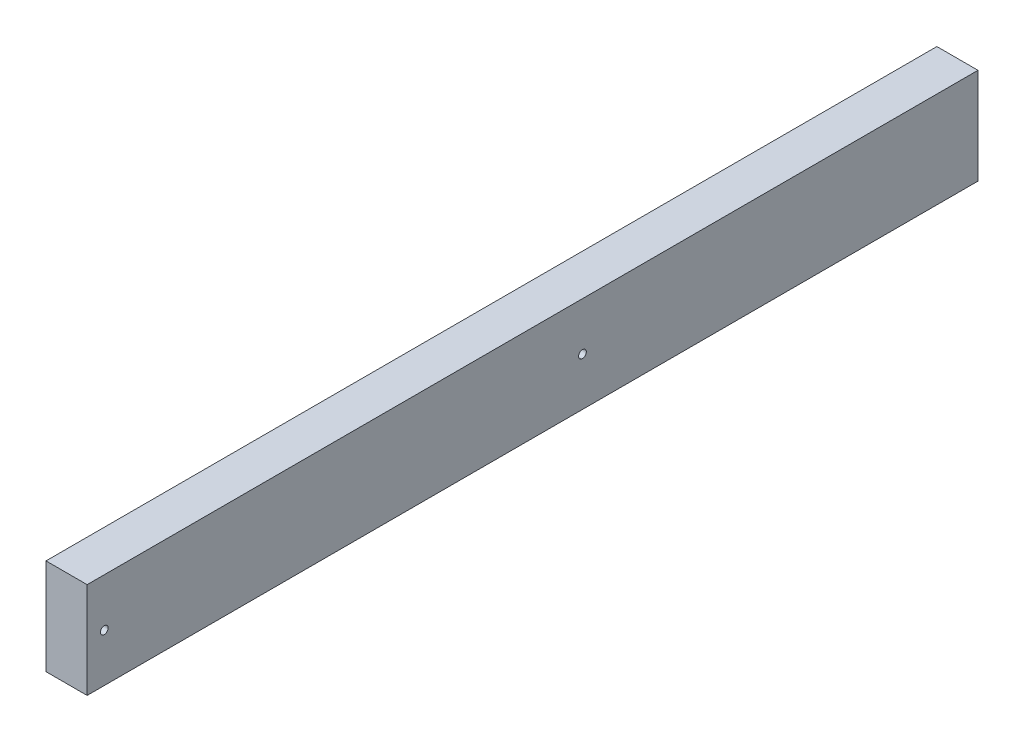
ISO-10303-21;
HEADER;
FILE_DESCRIPTION(('STEP AP214'),'2;1');
FILE_NAME('part.step','',(''),(''),'','','');
FILE_SCHEMA(('AUTOMOTIVE_DESIGN { 1 0 10303 214 1 1 1 1 }'));
ENDSEC;
DATA;
#1=APPLICATION_CONTEXT('core data for automotive mechanical design processes');
#2=APPLICATION_PROTOCOL_DEFINITION('international standard','automotive_design',2000,#1);
#3=PRODUCT_CONTEXT('',#1,'mechanical');
#4=PRODUCT('Part','Part','',(#3));
#5=PRODUCT_RELATED_PRODUCT_CATEGORY('part','',(#4));
#6=PRODUCT_DEFINITION_FORMATION('','',#4);
#7=PRODUCT_DEFINITION_CONTEXT('part definition',#1,'design');
#8=PRODUCT_DEFINITION('design','',#6,#7);
#9=PRODUCT_DEFINITION_SHAPE('','',#8);
#10=(LENGTH_UNIT() NAMED_UNIT(*) SI_UNIT(.MILLI.,.METRE.));
#11=(NAMED_UNIT(*) PLANE_ANGLE_UNIT() SI_UNIT($,.RADIAN.));
#12=(NAMED_UNIT(*) SI_UNIT($,.STERADIAN.) SOLID_ANGLE_UNIT());
#13=UNCERTAINTY_MEASURE_WITH_UNIT(LENGTH_MEASURE(1.E-05),#10,'distance_accuracy_value','');
#14=(GEOMETRIC_REPRESENTATION_CONTEXT(3) GLOBAL_UNCERTAINTY_ASSIGNED_CONTEXT((#13)) GLOBAL_UNIT_ASSIGNED_CONTEXT((#10,
#11,#12)) REPRESENTATION_CONTEXT('',''));
#15=CARTESIAN_POINT('',(0.,0.,0.));
#16=DIRECTION('',(0.,0.,1.));
#17=DIRECTION('',(1.,0.,0.));
#18=AXIS2_PLACEMENT_3D('',#15,#16,#17);
#19=CARTESIAN_POINT('',(38.1,88.8999999999993,3.43054021156412E-13));
#20=DIRECTION('',(0.,0.,-1.));
#21=DIRECTION('',(0.,1.,0.));
#22=AXIS2_PLACEMENT_3D('',#19,#20,#21);
#23=PLANE('',#22);
#24=DIRECTION('',(0.,-1.,0.));
#25=VECTOR('',#24,1.);
#26=CARTESIAN_POINT('',(0.,88.8999999999993,3.43054021156412E-13));
#27=LINE('',#26,#25);
#28=CARTESIAN_POINT('',(0.,88.8999999999993,3.43054021156412E-13));
#29=VERTEX_POINT('',#28);
#30=CARTESIAN_POINT('',(0.,0.,0.));
#31=VERTEX_POINT('',#30);
#32=EDGE_CURVE('E96',#29,#31,#27,.T.);
#33=ORIENTED_EDGE('',*,*,#32,.T.);
#34=DIRECTION('',(-1.,0.,0.));
#35=VECTOR('',#34,1.);
#36=CARTESIAN_POINT('',(38.1,0.,0.));
#37=LINE('',#36,#35);
#38=CARTESIAN_POINT('',(38.1,0.,0.));
#39=VERTEX_POINT('',#38);
#40=EDGE_CURVE('E11',#39,#31,#37,.T.);
#41=ORIENTED_EDGE('',*,*,#40,.F.);
#42=DIRECTION('',(0.,-1.,0.));
#43=VECTOR('',#42,1.);
#44=CARTESIAN_POINT('',(38.1,88.8999999999993,3.43054021156412E-13));
#45=LINE('',#44,#43);
#46=CARTESIAN_POINT('',(38.1,88.8999999999993,3.43054021156412E-13));
#47=VERTEX_POINT('',#46);
#48=EDGE_CURVE('E84',#47,#39,#45,.T.);
#49=ORIENTED_EDGE('',*,*,#48,.F.);
#50=DIRECTION('',(-1.,0.,0.));
#51=VECTOR('',#50,1.);
#52=CARTESIAN_POINT('',(38.1,88.8999999999993,3.43054021156412E-13));
#53=LINE('',#52,#51);
#54=EDGE_CURVE('E92',#47,#29,#53,.T.);
#55=ORIENTED_EDGE('',*,*,#54,.T.);
#56=EDGE_LOOP('',(#33,#41,#49,#55));
#57=FACE_BOUND('',#56,.T.);
#58=ADVANCED_FACE('F33',(#57),#23,.F.);
#59=CARTESIAN_POINT('',(38.1,0.,-825.177208973359));
#60=DIRECTION('',(0.,1.,0.));
#61=DIRECTION('',(0.,0.,1.));
#62=AXIS2_PLACEMENT_3D('',#59,#60,#61);
#63=PLANE('',#62);
#64=DIRECTION('',(0.,0.,-1.));
#65=VECTOR('',#64,1.);
#66=CARTESIAN_POINT('',(0.,0.,-825.177208973359));
#67=LINE('',#66,#65);
#68=CARTESIAN_POINT('',(0.,0.,-825.177208973359));
#69=VERTEX_POINT('',#68);
#70=EDGE_CURVE('E88',#31,#69,#67,.T.);
#71=ORIENTED_EDGE('',*,*,#70,.T.);
#72=DIRECTION('',(-1.,0.,0.));
#73=VECTOR('',#72,1.);
#74=CARTESIAN_POINT('',(38.1,0.,-825.177208973359));
#75=LINE('',#74,#73);
#76=CARTESIAN_POINT('',(38.1,0.,-825.177208973359));
#77=VERTEX_POINT('',#76);
#78=EDGE_CURVE('E41',#77,#69,#75,.T.);
#79=ORIENTED_EDGE('',*,*,#78,.F.);
#80=DIRECTION('',(0.,0.,-1.));
#81=VECTOR('',#80,1.);
#82=CARTESIAN_POINT('',(38.1,0.,-825.177208973359));
#83=LINE('',#82,#81);
#84=EDGE_CURVE('E79',#39,#77,#83,.T.);
#85=ORIENTED_EDGE('',*,*,#84,.F.);
#86=ORIENTED_EDGE('',*,*,#40,.T.);
#87=EDGE_LOOP('',(#71,#79,#85,#86));
#88=FACE_BOUND('',#87,.T.);
#89=ADVANCED_FACE('F87',(#88),#63,.F.);
#90=CARTESIAN_POINT('',(38.1,88.9000000000055,-825.177208973358));
#91=DIRECTION('',(0.,0.,1.));
#92=DIRECTION('',(0.,-1.,0.));
#93=AXIS2_PLACEMENT_3D('',#90,#91,#92);
#94=PLANE('',#93);
#95=DIRECTION('',(0.,1.,0.));
#96=VECTOR('',#95,1.);
#97=CARTESIAN_POINT('',(0.,88.9000000000055,-825.177208973358));
#98=LINE('',#97,#96);
#99=CARTESIAN_POINT('',(0.,88.9000000000055,-825.177208973358));
#100=VERTEX_POINT('',#99);
#101=EDGE_CURVE('E66',#69,#100,#98,.T.);
#102=ORIENTED_EDGE('',*,*,#101,.T.);
#103=DIRECTION('',(-1.,0.,0.));
#104=VECTOR('',#103,1.);
#105=CARTESIAN_POINT('',(38.1,88.9000000000055,-825.177208973358));
#106=LINE('',#105,#104);
#107=CARTESIAN_POINT('',(38.1,88.9000000000055,-825.177208973358));
#108=VERTEX_POINT('',#107);
#109=EDGE_CURVE('E89',#108,#100,#106,.T.);
#110=ORIENTED_EDGE('',*,*,#109,.F.);
#111=DIRECTION('',(0.,1.,0.));
#112=VECTOR('',#111,1.);
#113=CARTESIAN_POINT('',(38.1,88.9000000000055,-825.177208973358));
#114=LINE('',#113,#112);
#115=EDGE_CURVE('E82',#77,#108,#114,.T.);
#116=ORIENTED_EDGE('',*,*,#115,.F.);
#117=ORIENTED_EDGE('',*,*,#78,.T.);
#118=EDGE_LOOP('',(#102,#110,#116,#117));
#119=FACE_BOUND('',#118,.T.);
#120=ADVANCED_FACE('F90',(#119),#94,.F.);
#121=CARTESIAN_POINT('',(38.1,88.8999999999993,3.43054021156412E-13));
#122=DIRECTION('',(0.,-1.,0.));
#123=DIRECTION('',(0.,0.,-1.));
#124=AXIS2_PLACEMENT_3D('',#121,#122,#123);
#125=PLANE('',#124);
#126=DIRECTION('',(0.,0.,1.));
#127=VECTOR('',#126,1.);
#128=CARTESIAN_POINT('',(0.,88.8999999999993,3.43054021156412E-13));
#129=LINE('',#128,#127);
#130=EDGE_CURVE('E72',#100,#29,#129,.T.);
#131=ORIENTED_EDGE('',*,*,#130,.T.);
#132=ORIENTED_EDGE('',*,*,#54,.F.);
#133=DIRECTION('',(0.,0.,1.));
#134=VECTOR('',#133,1.);
#135=CARTESIAN_POINT('',(38.1,88.8999999999993,3.43054021156412E-13));
#136=LINE('',#135,#134);
#137=EDGE_CURVE('E49',#108,#47,#136,.T.);
#138=ORIENTED_EDGE('',*,*,#137,.F.);
#139=ORIENTED_EDGE('',*,*,#109,.T.);
#140=EDGE_LOOP('',(#131,#132,#138,#139));
#141=FACE_BOUND('',#140,.T.);
#142=ADVANCED_FACE('F104',(#141),#125,.F.);
#143=CARTESIAN_POINT('',(38.1,0.,0.));
#144=DIRECTION('',(-1.,0.,0.));
#145=DIRECTION('',(0.,0.,1.));
#146=AXIS2_PLACEMENT_3D('',#143,#144,#145);
#147=PLANE('',#146);
#148=CARTESIAN_POINT('',(38.1,44.45,-15.8749999999997));
#149=DIRECTION('',(1.,0.,0.));
#150=DIRECTION('',(0.,0.,-1.));
#151=AXIS2_PLACEMENT_3D('',#148,#149,#150);
#152=CIRCLE('',#151,3.571875);
#153=CARTESIAN_POINT('',(38.1,44.45,-19.4468749999997));
#154=VERTEX_POINT('',#153);
#155=EDGE_CURVE('E116',#154,#154,#152,.T.);
#156=ORIENTED_EDGE('',*,*,#155,.F.);
#157=EDGE_LOOP('',(#156));
#158=FACE_BOUND('',#157,.T.);
#159=CARTESIAN_POINT('',(38.1,44.45,-458.7875));
#160=DIRECTION('',(1.,0.,0.));
#161=DIRECTION('',(0.,0.,-1.));
#162=AXIS2_PLACEMENT_3D('',#159,#160,#161);
#163=CIRCLE('',#162,3.57187499999998);
#164=CARTESIAN_POINT('',(38.1,44.45,-462.359375));
#165=VERTEX_POINT('',#164);
#166=EDGE_CURVE('E110',#165,#165,#163,.T.);
#167=ORIENTED_EDGE('',*,*,#166,.F.);
#168=EDGE_LOOP('',(#167));
#169=FACE_BOUND('',#168,.T.);
#170=ORIENTED_EDGE('',*,*,#48,.T.);
#171=ORIENTED_EDGE('',*,*,#84,.T.);
#172=ORIENTED_EDGE('',*,*,#115,.T.);
#173=ORIENTED_EDGE('',*,*,#137,.T.);
#174=EDGE_LOOP('',(#170,#171,#172,#173));
#175=FACE_BOUND('',#174,.T.);
#176=ADVANCED_FACE('F80',(#158,#169,#175),#147,.F.);
#177=CARTESIAN_POINT('',(0.,0.,0.));
#178=DIRECTION('',(-1.,0.,0.));
#179=DIRECTION('',(0.,0.,1.));
#180=AXIS2_PLACEMENT_3D('',#177,#178,#179);
#181=PLANE('',#180);
#182=CARTESIAN_POINT('',(0.,44.45,-15.8749999999997));
#183=DIRECTION('',(1.,0.,0.));
#184=DIRECTION('',(0.,0.,-1.));
#185=AXIS2_PLACEMENT_3D('',#182,#183,#184);
#186=CIRCLE('',#185,3.571875);
#187=CARTESIAN_POINT('',(0.,44.45,-19.4468749999997));
#188=VERTEX_POINT('',#187);
#189=EDGE_CURVE('E99',#188,#188,#186,.T.);
#190=ORIENTED_EDGE('',*,*,#189,.T.);
#191=EDGE_LOOP('',(#190));
#192=FACE_BOUND('',#191,.T.);
#193=CARTESIAN_POINT('',(0.,44.45,-458.7875));
#194=DIRECTION('',(1.,0.,0.));
#195=DIRECTION('',(0.,0.,-1.));
#196=AXIS2_PLACEMENT_3D('',#193,#194,#195);
#197=CIRCLE('',#196,3.57187499999998);
#198=CARTESIAN_POINT('',(0.,44.45,-462.359375));
#199=VERTEX_POINT('',#198);
#200=EDGE_CURVE('E113',#199,#199,#197,.T.);
#201=ORIENTED_EDGE('',*,*,#200,.T.);
#202=EDGE_LOOP('',(#201));
#203=FACE_BOUND('',#202,.T.);
#204=ORIENTED_EDGE('',*,*,#32,.F.);
#205=ORIENTED_EDGE('',*,*,#130,.F.);
#206=ORIENTED_EDGE('',*,*,#101,.F.);
#207=ORIENTED_EDGE('',*,*,#70,.F.);
#208=EDGE_LOOP('',(#204,#205,#206,#207));
#209=FACE_BOUND('',#208,.T.);
#210=ADVANCED_FACE('F107',(#192,#203,#209),#181,.T.);
#211=CARTESIAN_POINT('',(0.,44.45,-458.7875));
#212=DIRECTION('',(1.,0.,0.));
#213=DIRECTION('',(0.,0.,-1.));
#214=AXIS2_PLACEMENT_3D('',#211,#212,#213);
#215=CYLINDRICAL_SURFACE('',#214,3.57187499999998);
#216=CARTESIAN_POINT('',(0.,44.45,-462.359375));
#217=CARTESIAN_POINT('',(0.396875,44.45,-462.359375));
#218=CARTESIAN_POINT('',(0.79375,44.45,-462.359375));
#219=CARTESIAN_POINT('',(1.5875,44.45,-462.359375));
#220=CARTESIAN_POINT('',(1.984375,44.45,-462.359375));
#221=CARTESIAN_POINT('',(2.778125,44.45,-462.359375));
#222=CARTESIAN_POINT('',(3.175,44.45,-462.359375));
#223=CARTESIAN_POINT('',(3.96875,44.45,-462.359375));
#224=CARTESIAN_POINT('',(4.365625,44.45,-462.359375));
#225=CARTESIAN_POINT('',(5.159375,44.45,-462.359375));
#226=CARTESIAN_POINT('',(5.55625,44.45,-462.359375));
#227=CARTESIAN_POINT('',(6.35,44.45,-462.359375));
#228=CARTESIAN_POINT('',(6.746875,44.45,-462.359375));
#229=CARTESIAN_POINT('',(7.540625,44.45,-462.359375));
#230=CARTESIAN_POINT('',(7.9375,44.45,-462.359375));
#231=CARTESIAN_POINT('',(8.73125,44.45,-462.359375));
#232=CARTESIAN_POINT('',(9.128125,44.45,-462.359375));
#233=CARTESIAN_POINT('',(9.921875,44.45,-462.359375));
#234=CARTESIAN_POINT('',(10.31875,44.45,-462.359375));
#235=CARTESIAN_POINT('',(11.1125,44.45,-462.359375));
#236=CARTESIAN_POINT('',(11.509375,44.45,-462.359375));
#237=CARTESIAN_POINT('',(12.303125,44.45,-462.359375));
#238=CARTESIAN_POINT('',(12.7,44.45,-462.359375));
#239=CARTESIAN_POINT('',(13.49375,44.45,-462.359375));
#240=CARTESIAN_POINT('',(13.890625,44.45,-462.359375));
#241=CARTESIAN_POINT('',(14.684375,44.45,-462.359375));
#242=CARTESIAN_POINT('',(15.08125,44.45,-462.359375));
#243=CARTESIAN_POINT('',(15.875,44.45,-462.359375));
#244=CARTESIAN_POINT('',(16.271875,44.45,-462.359375));
#245=CARTESIAN_POINT('',(17.065625,44.45,-462.359375));
#246=CARTESIAN_POINT('',(17.4625,44.45,-462.359375));
#247=CARTESIAN_POINT('',(18.25625,44.45,-462.359375));
#248=CARTESIAN_POINT('',(18.653125,44.45,-462.359375));
#249=CARTESIAN_POINT('',(19.446875,44.45,-462.359375));
#250=CARTESIAN_POINT('',(19.84375,44.45,-462.359375));
#251=CARTESIAN_POINT('',(20.6375,44.45,-462.359375));
#252=CARTESIAN_POINT('',(21.034375,44.45,-462.359375));
#253=CARTESIAN_POINT('',(21.828125,44.45,-462.359375));
#254=CARTESIAN_POINT('',(22.225,44.45,-462.359375));
#255=CARTESIAN_POINT('',(23.01875,44.45,-462.359375));
#256=CARTESIAN_POINT('',(23.415625,44.45,-462.359375));
#257=CARTESIAN_POINT('',(24.209375,44.45,-462.359375));
#258=CARTESIAN_POINT('',(24.60625,44.45,-462.359375));
#259=CARTESIAN_POINT('',(25.4,44.45,-462.359375));
#260=CARTESIAN_POINT('',(25.796875,44.45,-462.359375));
#261=CARTESIAN_POINT('',(26.590625,44.45,-462.359375));
#262=CARTESIAN_POINT('',(26.9875,44.45,-462.359375));
#263=CARTESIAN_POINT('',(27.78125,44.45,-462.359375));
#264=CARTESIAN_POINT('',(28.178125,44.45,-462.359375));
#265=CARTESIAN_POINT('',(28.971875,44.45,-462.359375));
#266=CARTESIAN_POINT('',(29.36875,44.45,-462.359375));
#267=CARTESIAN_POINT('',(30.1625,44.45,-462.359375));
#268=CARTESIAN_POINT('',(30.559375,44.45,-462.359375));
#269=CARTESIAN_POINT('',(31.353125,44.45,-462.359375));
#270=CARTESIAN_POINT('',(31.75,44.45,-462.359375));
#271=CARTESIAN_POINT('',(32.54375,44.45,-462.359375));
#272=CARTESIAN_POINT('',(32.940625,44.45,-462.359375));
#273=CARTESIAN_POINT('',(33.734375,44.45,-462.359375));
#274=CARTESIAN_POINT('',(34.13125,44.45,-462.359375));
#275=CARTESIAN_POINT('',(34.925,44.45,-462.359375));
#276=CARTESIAN_POINT('',(35.321875,44.45,-462.359375));
#277=CARTESIAN_POINT('',(36.115625,44.45,-462.359375));
#278=CARTESIAN_POINT('',(36.5125,44.45,-462.359375));
#279=CARTESIAN_POINT('',(37.30625,44.45,-462.359375));
#280=CARTESIAN_POINT('',(37.703125,44.45,-462.359375));
#281=CARTESIAN_POINT('',(38.1,44.45,-462.359375));
#282=B_SPLINE_CURVE_WITH_KNOTS('',3,(#216,#217,#218,#219,#220,#221,#222,#223,#224,#225,#226,
#227,#228,#229,#230,#231,#232,#233,#234,#235,#236,#237,#238,#239,#240,#241,#242,#243,#244,#245,
#246,#247,#248,#249,#250,#251,#252,#253,#254,#255,#256,#257,#258,#259,#260,#261,#262,#263,#264,
#265,#266,#267,#268,#269,#270,#271,#272,#273,#274,#275,#276,#277,#278,#279,#280,#281),
.UNSPECIFIED.,.F.,.F.,(4,2,2,2,2,2,2,2,2,2,2,2,2,2,2,2,2,2,2,2,2,2,2,2,2,2,2,2,2,2,2,2,4),(0.,
1.190625,2.38125,3.571875,4.7625,5.953125,7.14375,8.334375,9.525,10.715625,11.90625,13.096875,
14.2875,15.478125,16.66875,17.859375,19.05,20.240625,21.43125,22.621875,23.8125,25.003125,
26.19375,27.384375,28.575,29.765625,30.95625,32.146875,33.3375,34.528125,35.71875,36.909375,
38.1),.UNSPECIFIED.);
#283=EDGE_CURVE('BSEAM127',#199,#165,#282,.T.);
#284=ORIENTED_EDGE('',*,*,#200,.F.);
#285=ORIENTED_EDGE('',*,*,#166,.T.);
#286=ORIENTED_EDGE('',*,*,#283,.T.);
#287=ORIENTED_EDGE('',*,*,#283,.F.);
#288=EDGE_LOOP('',(#284,#286,#285,#287));
#289=FACE_BOUND('',#288,.T.);
#290=ADVANCED_FACE('F127',(#289),#215,.F.);
#291=CARTESIAN_POINT('',(0.,44.45,-15.8749999999997));
#292=DIRECTION('',(1.,0.,0.));
#293=DIRECTION('',(0.,0.,-1.));
#294=AXIS2_PLACEMENT_3D('',#291,#292,#293);
#295=CYLINDRICAL_SURFACE('',#294,3.571875);
#296=CARTESIAN_POINT('',(0.,44.45,-19.4468749999997));
#297=CARTESIAN_POINT('',(0.396875,44.45,-19.4468749999997));
#298=CARTESIAN_POINT('',(0.79375,44.45,-19.4468749999997));
#299=CARTESIAN_POINT('',(1.5875,44.45,-19.4468749999997));
#300=CARTESIAN_POINT('',(1.984375,44.45,-19.4468749999997));
#301=CARTESIAN_POINT('',(2.778125,44.45,-19.4468749999997));
#302=CARTESIAN_POINT('',(3.175,44.45,-19.4468749999997));
#303=CARTESIAN_POINT('',(3.96875,44.45,-19.4468749999997));
#304=CARTESIAN_POINT('',(4.365625,44.45,-19.4468749999997));
#305=CARTESIAN_POINT('',(5.159375,44.45,-19.4468749999997));
#306=CARTESIAN_POINT('',(5.55625,44.45,-19.4468749999997));
#307=CARTESIAN_POINT('',(6.35,44.45,-19.4468749999997));
#308=CARTESIAN_POINT('',(6.746875,44.45,-19.4468749999997));
#309=CARTESIAN_POINT('',(7.540625,44.45,-19.4468749999997));
#310=CARTESIAN_POINT('',(7.9375,44.45,-19.4468749999997));
#311=CARTESIAN_POINT('',(8.73125,44.45,-19.4468749999997));
#312=CARTESIAN_POINT('',(9.128125,44.45,-19.4468749999997));
#313=CARTESIAN_POINT('',(9.921875,44.45,-19.4468749999997));
#314=CARTESIAN_POINT('',(10.31875,44.45,-19.4468749999997));
#315=CARTESIAN_POINT('',(11.1125,44.45,-19.4468749999997));
#316=CARTESIAN_POINT('',(11.509375,44.45,-19.4468749999997));
#317=CARTESIAN_POINT('',(12.303125,44.45,-19.4468749999997));
#318=CARTESIAN_POINT('',(12.7,44.45,-19.4468749999997));
#319=CARTESIAN_POINT('',(13.49375,44.45,-19.4468749999997));
#320=CARTESIAN_POINT('',(13.890625,44.45,-19.4468749999997));
#321=CARTESIAN_POINT('',(14.684375,44.45,-19.4468749999997));
#322=CARTESIAN_POINT('',(15.08125,44.45,-19.4468749999997));
#323=CARTESIAN_POINT('',(15.875,44.45,-19.4468749999997));
#324=CARTESIAN_POINT('',(16.271875,44.45,-19.4468749999997));
#325=CARTESIAN_POINT('',(17.065625,44.45,-19.4468749999997));
#326=CARTESIAN_POINT('',(17.4625,44.45,-19.4468749999997));
#327=CARTESIAN_POINT('',(18.25625,44.45,-19.4468749999997));
#328=CARTESIAN_POINT('',(18.653125,44.45,-19.4468749999997));
#329=CARTESIAN_POINT('',(19.446875,44.45,-19.4468749999997));
#330=CARTESIAN_POINT('',(19.84375,44.45,-19.4468749999997));
#331=CARTESIAN_POINT('',(20.6375,44.45,-19.4468749999997));
#332=CARTESIAN_POINT('',(21.034375,44.45,-19.4468749999997));
#333=CARTESIAN_POINT('',(21.828125,44.45,-19.4468749999997));
#334=CARTESIAN_POINT('',(22.225,44.45,-19.4468749999997));
#335=CARTESIAN_POINT('',(23.01875,44.45,-19.4468749999997));
#336=CARTESIAN_POINT('',(23.415625,44.45,-19.4468749999997));
#337=CARTESIAN_POINT('',(24.209375,44.45,-19.4468749999997));
#338=CARTESIAN_POINT('',(24.60625,44.45,-19.4468749999997));
#339=CARTESIAN_POINT('',(25.4,44.45,-19.4468749999997));
#340=CARTESIAN_POINT('',(25.796875,44.45,-19.4468749999997));
#341=CARTESIAN_POINT('',(26.590625,44.45,-19.4468749999997));
#342=CARTESIAN_POINT('',(26.9875,44.45,-19.4468749999997));
#343=CARTESIAN_POINT('',(27.78125,44.45,-19.4468749999997));
#344=CARTESIAN_POINT('',(28.178125,44.45,-19.4468749999997));
#345=CARTESIAN_POINT('',(28.971875,44.45,-19.4468749999997));
#346=CARTESIAN_POINT('',(29.36875,44.45,-19.4468749999997));
#347=CARTESIAN_POINT('',(30.1625,44.45,-19.4468749999997));
#348=CARTESIAN_POINT('',(30.559375,44.45,-19.4468749999997));
#349=CARTESIAN_POINT('',(31.353125,44.45,-19.4468749999997));
#350=CARTESIAN_POINT('',(31.75,44.45,-19.4468749999997));
#351=CARTESIAN_POINT('',(32.54375,44.45,-19.4468749999997));
#352=CARTESIAN_POINT('',(32.940625,44.45,-19.4468749999997));
#353=CARTESIAN_POINT('',(33.734375,44.45,-19.4468749999997));
#354=CARTESIAN_POINT('',(34.13125,44.45,-19.4468749999997));
#355=CARTESIAN_POINT('',(34.925,44.45,-19.4468749999997));
#356=CARTESIAN_POINT('',(35.321875,44.45,-19.4468749999997));
#357=CARTESIAN_POINT('',(36.115625,44.45,-19.4468749999997));
#358=CARTESIAN_POINT('',(36.5125,44.45,-19.4468749999997));
#359=CARTESIAN_POINT('',(37.30625,44.45,-19.4468749999997));
#360=CARTESIAN_POINT('',(37.703125,44.45,-19.4468749999997));
#361=CARTESIAN_POINT('',(38.1,44.45,-19.4468749999997));
#362=B_SPLINE_CURVE_WITH_KNOTS('',3,(#296,#297,#298,#299,#300,#301,#302,#303,#304,#305,#306,
#307,#308,#309,#310,#311,#312,#313,#314,#315,#316,#317,#318,#319,#320,#321,#322,#323,#324,#325,
#326,#327,#328,#329,#330,#331,#332,#333,#334,#335,#336,#337,#338,#339,#340,#341,#342,#343,#344,
#345,#346,#347,#348,#349,#350,#351,#352,#353,#354,#355,#356,#357,#358,#359,#360,#361),
.UNSPECIFIED.,.F.,.F.,(4,2,2,2,2,2,2,2,2,2,2,2,2,2,2,2,2,2,2,2,2,2,2,2,2,2,2,2,2,2,2,2,4),(0.,
1.190625,2.38125,3.571875,4.7625,5.953125,7.14375,8.334375,9.525,10.715625,11.90625,13.096875,
14.2875,15.478125,16.66875,17.859375,19.05,20.240625,21.43125,22.621875,23.8125,25.003125,
26.19375,27.384375,28.575,29.765625,30.95625,32.146875,33.3375,34.528125,35.71875,36.909375,
38.1),.UNSPECIFIED.);
#363=EDGE_CURVE('BSEAM124',#188,#154,#362,.T.);
#364=ORIENTED_EDGE('',*,*,#189,.F.);
#365=ORIENTED_EDGE('',*,*,#155,.T.);
#366=ORIENTED_EDGE('',*,*,#363,.T.);
#367=ORIENTED_EDGE('',*,*,#363,.F.);
#368=EDGE_LOOP('',(#364,#366,#365,#367));
#369=FACE_BOUND('',#368,.T.);
#370=ADVANCED_FACE('F124',(#369),#295,.F.);
#371=CLOSED_SHELL('',(#58,#89,#120,#142,#176,#210,#290,#370));
#372=MANIFOLD_SOLID_BREP('B2',#371);
#373=ADVANCED_BREP_SHAPE_REPRESENTATION('',(#18,#372),#14);
#374=SHAPE_DEFINITION_REPRESENTATION(#9,#373);
ENDSEC;
END-ISO-10303-21;
